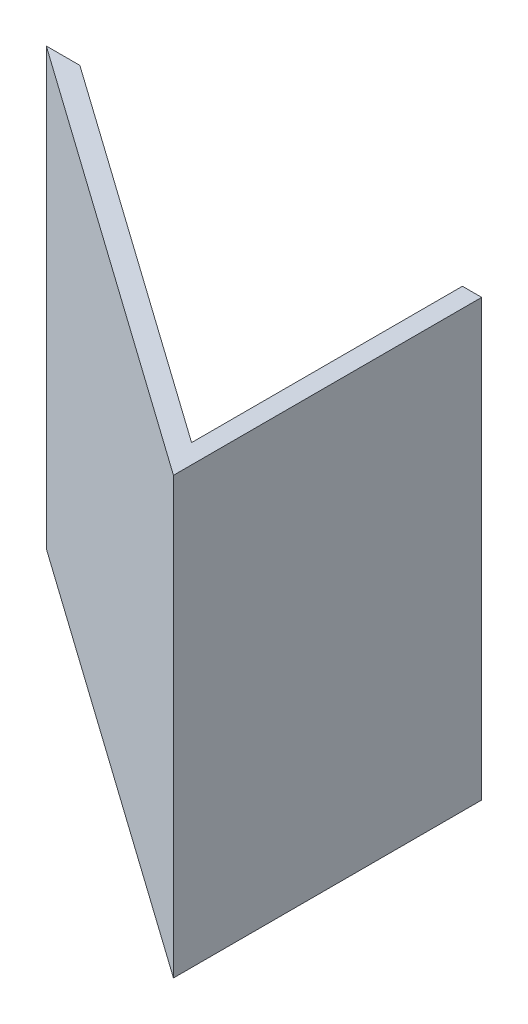
ISO-10303-21;
HEADER;
FILE_DESCRIPTION(('STEP AP214'),'2;1');
FILE_NAME('part.step','',(''),(''),'','','');
FILE_SCHEMA(('AUTOMOTIVE_DESIGN { 1 0 10303 214 1 1 1 1 }'));
ENDSEC;
DATA;
#1=APPLICATION_CONTEXT('core data for automotive mechanical design processes');
#2=APPLICATION_PROTOCOL_DEFINITION('international standard','automotive_design',2000,#1);
#3=PRODUCT_CONTEXT('',#1,'mechanical');
#4=PRODUCT('Part','Part','',(#3));
#5=PRODUCT_RELATED_PRODUCT_CATEGORY('part','',(#4));
#6=PRODUCT_DEFINITION_FORMATION('','',#4);
#7=PRODUCT_DEFINITION_CONTEXT('part definition',#1,'design');
#8=PRODUCT_DEFINITION('design','',#6,#7);
#9=PRODUCT_DEFINITION_SHAPE('','',#8);
#10=(LENGTH_UNIT() NAMED_UNIT(*) SI_UNIT(.MILLI.,.METRE.));
#11=(NAMED_UNIT(*) PLANE_ANGLE_UNIT() SI_UNIT($,.RADIAN.));
#12=(NAMED_UNIT(*) SI_UNIT($,.STERADIAN.) SOLID_ANGLE_UNIT());
#13=UNCERTAINTY_MEASURE_WITH_UNIT(LENGTH_MEASURE(1.E-05),#10,'distance_accuracy_value','');
#14=(GEOMETRIC_REPRESENTATION_CONTEXT(3) GLOBAL_UNCERTAINTY_ASSIGNED_CONTEXT((#13)) GLOBAL_UNIT_ASSIGNED_CONTEXT((#10,
#11,#12)) REPRESENTATION_CONTEXT('',''));
#15=CARTESIAN_POINT('',(0.,0.,0.));
#16=DIRECTION('',(0.,0.,1.));
#17=DIRECTION('',(1.,0.,0.));
#18=AXIS2_PLACEMENT_3D('',#15,#16,#17);
#19=CARTESIAN_POINT('',(-6.72788323187605,71.755,-34.1908451260969));
#20=DIRECTION('',(0.,0.,1.));
#21=DIRECTION('',(1.,0.,0.));
#22=AXIS2_PLACEMENT_3D('',#19,#20,#21);
#23=PLANE('',#22);
#24=DIRECTION('',(-1.,0.,0.));
#25=VECTOR('',#24,1.);
#26=CARTESIAN_POINT('',(-6.72788323187605,0.,-34.1908451260969));
#27=LINE('',#26,#25);
#28=CARTESIAN_POINT('',(-1.20084323187605,0.,-34.1908451260969));
#29=VERTEX_POINT('',#28);
#30=CARTESIAN_POINT('',(-6.72788323187605,0.,-34.1908451260969));
#31=VERTEX_POINT('',#30);
#32=EDGE_CURVE('E119',#29,#31,#27,.T.);
#33=ORIENTED_EDGE('',*,*,#32,.T.);
#34=DIRECTION('',(0.,-1.,0.));
#35=VECTOR('',#34,1.);
#36=CARTESIAN_POINT('',(-6.72788323187605,71.755,-34.1908451260969));
#37=LINE('',#36,#35);
#38=CARTESIAN_POINT('',(-6.72788323187605,71.755,-34.1908451260969));
#39=VERTEX_POINT('',#38);
#40=EDGE_CURVE('E11',#39,#31,#37,.T.);
#41=ORIENTED_EDGE('',*,*,#40,.F.);
#42=DIRECTION('',(-1.,0.,0.));
#43=VECTOR('',#42,1.);
#44=CARTESIAN_POINT('',(-6.72788323187605,71.755,-34.1908451260969));
#45=LINE('',#44,#43);
#46=CARTESIAN_POINT('',(-1.20084323187605,71.755,-34.1908451260969));
#47=VERTEX_POINT('',#46);
#48=EDGE_CURVE('E129',#47,#39,#45,.T.);
#49=ORIENTED_EDGE('',*,*,#48,.F.);
#50=DIRECTION('',(0.,-1.,0.));
#51=VECTOR('',#50,1.);
#52=CARTESIAN_POINT('',(-1.20084323187605,71.755,-34.1908451260969));
#53=LINE('',#52,#51);
#54=EDGE_CURVE('E115',#47,#29,#53,.T.);
#55=ORIENTED_EDGE('',*,*,#54,.T.);
#56=EDGE_LOOP('',(#33,#41,#49,#55));
#57=FACE_BOUND('',#56,.T.);
#58=ADVANCED_FACE('F35',(#57),#23,.F.);
#59=CARTESIAN_POINT('',(-6.72788323187605,71.755,-34.1908451260969));
#60=DIRECTION('',(0.577816924417098,0.,-0.816166405739152));
#61=DIRECTION('',(-0.816166405739152,0.,-0.577816924417098));
#62=AXIS2_PLACEMENT_3D('',#59,#60,#61);
#63=PLANE('',#62);
#64=DIRECTION('',(0.816166405739151,0.,0.577816924417098));
#65=VECTOR('',#64,1.);
#66=CARTESIAN_POINT('',(-6.72788323187605,0.,-34.1908451260969));
#67=LINE('',#66,#65);
#68=CARTESIAN_POINT('',(65.0271167681239,0.,16.6091548739031));
#69=VERTEX_POINT('',#68);
#70=EDGE_CURVE('E122',#31,#69,#67,.T.);
#71=ORIENTED_EDGE('',*,*,#70,.T.);
#72=DIRECTION('',(0.,-1.,0.));
#73=VECTOR('',#72,1.);
#74=CARTESIAN_POINT('',(65.0271167681239,71.755,16.6091548739031));
#75=LINE('',#74,#73);
#76=CARTESIAN_POINT('',(65.0271167681239,71.755,16.6091548739031));
#77=VERTEX_POINT('',#76);
#78=EDGE_CURVE('E43',#77,#69,#75,.T.);
#79=ORIENTED_EDGE('',*,*,#78,.F.);
#80=DIRECTION('',(0.816166405739151,0.,0.577816924417098));
#81=VECTOR('',#80,1.);
#82=CARTESIAN_POINT('',(-6.72788323187605,71.755,-34.1908451260969));
#83=LINE('',#82,#81);
#84=EDGE_CURVE('E88',#39,#77,#83,.T.);
#85=ORIENTED_EDGE('',*,*,#84,.F.);
#86=ORIENTED_EDGE('',*,*,#40,.T.);
#87=EDGE_LOOP('',(#71,#79,#85,#86));
#88=FACE_BOUND('',#87,.T.);
#89=ADVANCED_FACE('F153',(#88),#63,.F.);
#90=CARTESIAN_POINT('',(65.0271167681239,71.755,-34.1908451260969));
#91=DIRECTION('',(-1.,0.,0.));
#92=DIRECTION('',(0.,0.,1.));
#93=AXIS2_PLACEMENT_3D('',#90,#91,#92);
#94=PLANE('',#93);
#95=DIRECTION('',(0.,0.,-1.));
#96=VECTOR('',#95,1.);
#97=CARTESIAN_POINT('',(65.0271167681239,0.,-34.1908451260969));
#98=LINE('',#97,#96);
#99=CARTESIAN_POINT('',(65.0271167681239,0.,-34.1908451260969));
#100=VERTEX_POINT('',#99);
#101=EDGE_CURVE('E124',#69,#100,#98,.T.);
#102=ORIENTED_EDGE('',*,*,#101,.T.);
#103=DIRECTION('',(0.,-1.,0.));
#104=VECTOR('',#103,1.);
#105=CARTESIAN_POINT('',(65.0271167681239,71.755,-34.1908451260969));
#106=LINE('',#105,#104);
#107=CARTESIAN_POINT('',(65.0271167681239,71.755,-34.1908451260969));
#108=VERTEX_POINT('',#107);
#109=EDGE_CURVE('E110',#108,#100,#106,.T.);
#110=ORIENTED_EDGE('',*,*,#109,.F.);
#111=DIRECTION('',(0.,0.,-1.));
#112=VECTOR('',#111,1.);
#113=CARTESIAN_POINT('',(65.0271167681239,71.755,-34.1908451260969));
#114=LINE('',#113,#112);
#115=EDGE_CURVE('E101',#77,#108,#114,.T.);
#116=ORIENTED_EDGE('',*,*,#115,.F.);
#117=ORIENTED_EDGE('',*,*,#78,.T.);
#118=EDGE_LOOP('',(#102,#110,#116,#117));
#119=FACE_BOUND('',#118,.T.);
#120=ADVANCED_FACE('F135',(#119),#94,.F.);
#121=CARTESIAN_POINT('',(65.0271167681239,71.755,-34.1908451260969));
#122=DIRECTION('',(0.,0.,1.));
#123=DIRECTION('',(1.,0.,0.));
#124=AXIS2_PLACEMENT_3D('',#121,#122,#123);
#125=PLANE('',#124);
#126=DIRECTION('',(-1.,0.,0.));
#127=VECTOR('',#126,1.);
#128=CARTESIAN_POINT('',(65.0271167681239,0.,-34.1908451260969));
#129=LINE('',#128,#127);
#130=CARTESIAN_POINT('',(61.8521167681239,0.,-34.1908451260969));
#131=VERTEX_POINT('',#130);
#132=EDGE_CURVE('E109',#100,#131,#129,.T.);
#133=ORIENTED_EDGE('',*,*,#132,.T.);
#134=DIRECTION('',(0.,-1.,0.));
#135=VECTOR('',#134,1.);
#136=CARTESIAN_POINT('',(61.8521167681239,71.755,-34.1908451260969));
#137=LINE('',#136,#135);
#138=CARTESIAN_POINT('',(61.8521167681239,71.755,-34.1908451260969));
#139=VERTEX_POINT('',#138);
#140=EDGE_CURVE('E106',#139,#131,#137,.T.);
#141=ORIENTED_EDGE('',*,*,#140,.F.);
#142=DIRECTION('',(-1.,0.,0.));
#143=VECTOR('',#142,1.);
#144=CARTESIAN_POINT('',(65.0271167681239,71.755,-34.1908451260969));
#145=LINE('',#144,#143);
#146=EDGE_CURVE('E95',#108,#139,#145,.T.);
#147=ORIENTED_EDGE('',*,*,#146,.F.);
#148=ORIENTED_EDGE('',*,*,#109,.T.);
#149=EDGE_LOOP('',(#133,#141,#147,#148));
#150=FACE_BOUND('',#149,.T.);
#151=ADVANCED_FACE('F107',(#150),#125,.F.);
#152=CARTESIAN_POINT('',(61.8521167681239,71.755,-34.1908451260969));
#153=DIRECTION('',(1.,0.,0.));
#154=DIRECTION('',(0.,0.,-1.));
#155=AXIS2_PLACEMENT_3D('',#152,#153,#154);
#156=PLANE('',#155);
#157=DIRECTION('',(0.,0.,1.));
#158=VECTOR('',#157,1.);
#159=CARTESIAN_POINT('',(61.8521167681239,0.,-34.1908451260969));
#160=LINE('',#159,#158);
#161=CARTESIAN_POINT('',(61.8521167681239,0.,10.4496548739031));
#162=VERTEX_POINT('',#161);
#163=EDGE_CURVE('E74',#131,#162,#160,.T.);
#164=ORIENTED_EDGE('',*,*,#163,.T.);
#165=DIRECTION('',(0.,-1.,0.));
#166=VECTOR('',#165,1.);
#167=CARTESIAN_POINT('',(61.8521167681239,71.755,10.4496548739031));
#168=LINE('',#167,#166);
#169=CARTESIAN_POINT('',(61.8521167681239,71.755,10.4496548739031));
#170=VERTEX_POINT('',#169);
#171=EDGE_CURVE('E111',#170,#162,#168,.T.);
#172=ORIENTED_EDGE('',*,*,#171,.F.);
#173=DIRECTION('',(0.,0.,1.));
#174=VECTOR('',#173,1.);
#175=CARTESIAN_POINT('',(61.8521167681239,71.755,-34.1908451260969));
#176=LINE('',#175,#174);
#177=EDGE_CURVE('E99',#139,#170,#176,.T.);
#178=ORIENTED_EDGE('',*,*,#177,.F.);
#179=ORIENTED_EDGE('',*,*,#140,.T.);
#180=EDGE_LOOP('',(#164,#172,#178,#179));
#181=FACE_BOUND('',#180,.T.);
#182=ADVANCED_FACE('F113',(#181),#156,.F.);
#183=CARTESIAN_POINT('',(-1.20084323187605,71.755,-34.1908451260969));
#184=DIRECTION('',(-0.577827584058727,0.,0.816158858985709));
#185=DIRECTION('',(0.816158858985709,0.,0.577827584058727));
#186=AXIS2_PLACEMENT_3D('',#183,#184,#185);
#187=PLANE('',#186);
#188=DIRECTION('',(-0.816158858985709,0.,-0.577827584058727));
#189=VECTOR('',#188,1.);
#190=CARTESIAN_POINT('',(-1.20084323187605,0.,-34.1908451260969));
#191=LINE('',#190,#189);
#192=EDGE_CURVE('E80',#162,#29,#191,.T.);
#193=ORIENTED_EDGE('',*,*,#192,.T.);
#194=ORIENTED_EDGE('',*,*,#54,.F.);
#195=DIRECTION('',(-0.816158858985709,0.,-0.577827584058727));
#196=VECTOR('',#195,1.);
#197=CARTESIAN_POINT('',(-1.20084323187605,71.755,-34.1908451260969));
#198=LINE('',#197,#196);
#199=EDGE_CURVE('E51',#170,#47,#198,.T.);
#200=ORIENTED_EDGE('',*,*,#199,.F.);
#201=ORIENTED_EDGE('',*,*,#171,.T.);
#202=EDGE_LOOP('',(#193,#194,#200,#201));
#203=FACE_BOUND('',#202,.T.);
#204=ADVANCED_FACE('F142',(#203),#187,.F.);
#205=CARTESIAN_POINT('',(0.,71.755,0.));
#206=DIRECTION('',(0.,-1.,0.));
#207=DIRECTION('',(0.,0.,-1.));
#208=AXIS2_PLACEMENT_3D('',#205,#206,#207);
#209=PLANE('',#208);
#210=ORIENTED_EDGE('',*,*,#48,.T.);
#211=ORIENTED_EDGE('',*,*,#84,.T.);
#212=ORIENTED_EDGE('',*,*,#115,.T.);
#213=ORIENTED_EDGE('',*,*,#146,.T.);
#214=ORIENTED_EDGE('',*,*,#177,.T.);
#215=ORIENTED_EDGE('',*,*,#199,.T.);
#216=EDGE_LOOP('',(#210,#211,#212,#213,#214,#215));
#217=FACE_BOUND('',#216,.T.);
#218=ADVANCED_FACE('F97',(#217),#209,.F.);
#219=CARTESIAN_POINT('',(0.,0.,0.));
#220=DIRECTION('',(0.,-1.,0.));
#221=DIRECTION('',(0.,0.,-1.));
#222=AXIS2_PLACEMENT_3D('',#219,#220,#221);
#223=PLANE('',#222);
#224=ORIENTED_EDGE('',*,*,#32,.F.);
#225=ORIENTED_EDGE('',*,*,#192,.F.);
#226=ORIENTED_EDGE('',*,*,#163,.F.);
#227=ORIENTED_EDGE('',*,*,#132,.F.);
#228=ORIENTED_EDGE('',*,*,#101,.F.);
#229=ORIENTED_EDGE('',*,*,#70,.F.);
#230=EDGE_LOOP('',(#224,#225,#226,#227,#228,#229));
#231=FACE_BOUND('',#230,.T.);
#232=ADVANCED_FACE('F138',(#231),#223,.T.);
#233=CLOSED_SHELL('',(#58,#89,#120,#151,#182,#204,#218,#232));
#234=MANIFOLD_SOLID_BREP('B2',#233);
#235=ADVANCED_BREP_SHAPE_REPRESENTATION('',(#18,#234),#14);
#236=SHAPE_DEFINITION_REPRESENTATION(#9,#235);
ENDSEC;
END-ISO-10303-21;
